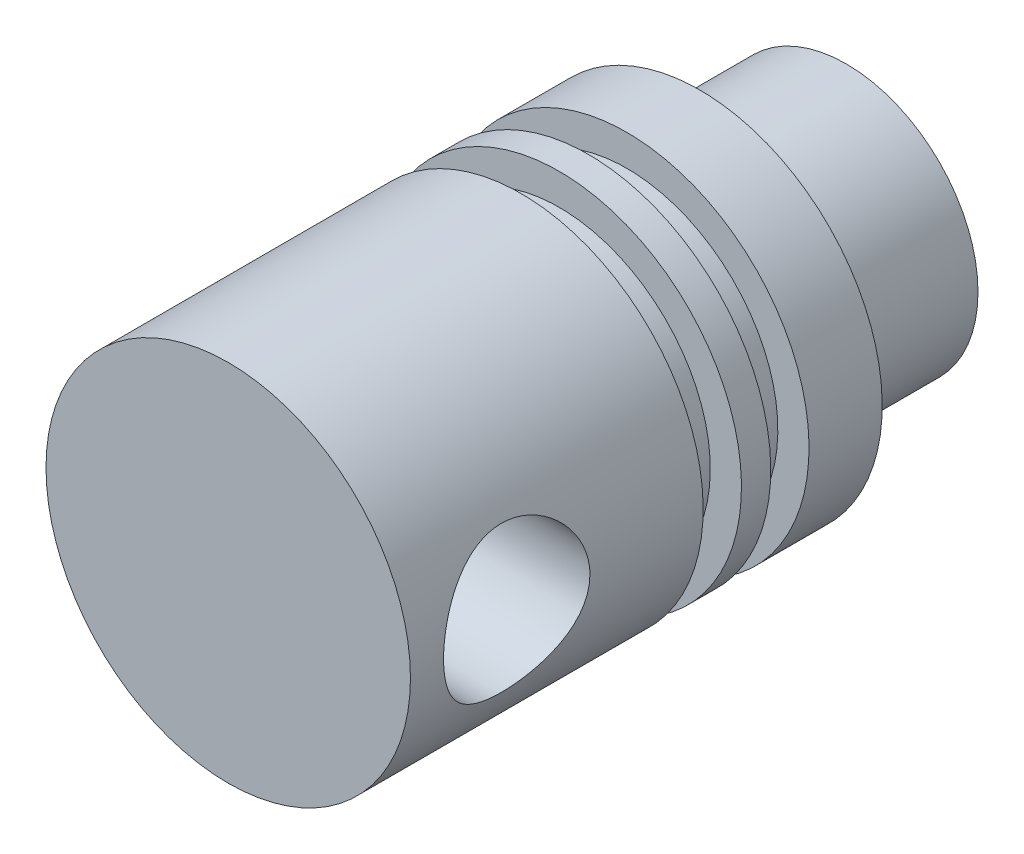
ISO-10303-21;
HEADER;
FILE_DESCRIPTION(('STEP AP214'),'2;1');
FILE_NAME('part.step','',(''),(''),'','','');
FILE_SCHEMA(('AUTOMOTIVE_DESIGN { 1 0 10303 214 1 1 1 1 }'));
ENDSEC;
DATA;
#1=APPLICATION_CONTEXT('core data for automotive mechanical design processes');
#2=APPLICATION_PROTOCOL_DEFINITION('international standard','automotive_design',2000,#1);
#3=PRODUCT_CONTEXT('',#1,'mechanical');
#4=PRODUCT('Part','Part','',(#3));
#5=PRODUCT_RELATED_PRODUCT_CATEGORY('part','',(#4));
#6=PRODUCT_DEFINITION_FORMATION('','',#4);
#7=PRODUCT_DEFINITION_CONTEXT('part definition',#1,'design');
#8=PRODUCT_DEFINITION('design','',#6,#7);
#9=PRODUCT_DEFINITION_SHAPE('','',#8);
#10=(LENGTH_UNIT() NAMED_UNIT(*) SI_UNIT(.MILLI.,.METRE.));
#11=(NAMED_UNIT(*) PLANE_ANGLE_UNIT() SI_UNIT($,.RADIAN.));
#12=(NAMED_UNIT(*) SI_UNIT($,.STERADIAN.) SOLID_ANGLE_UNIT());
#13=UNCERTAINTY_MEASURE_WITH_UNIT(LENGTH_MEASURE(1.E-05),#10,'distance_accuracy_value','');
#14=(GEOMETRIC_REPRESENTATION_CONTEXT(3) GLOBAL_UNCERTAINTY_ASSIGNED_CONTEXT((#13)) GLOBAL_UNIT_ASSIGNED_CONTEXT((#10,
#11,#12)) REPRESENTATION_CONTEXT('',''));
#15=CARTESIAN_POINT('',(0.,0.,0.));
#16=DIRECTION('',(0.,0.,1.));
#17=DIRECTION('',(1.,0.,0.));
#18=AXIS2_PLACEMENT_3D('',#15,#16,#17);
#19=CARTESIAN_POINT('',(0.,0.,0.));
#20=DIRECTION('',(0.,0.,1.));
#21=DIRECTION('',(0.,-1.,0.));
#22=AXIS2_PLACEMENT_3D('',#19,#20,#21);
#23=PLANE('',#22);
#24=CARTESIAN_POINT('',(0.,0.,0.));
#25=DIRECTION('',(0.,0.,1.));
#26=DIRECTION('',(0.,-1.,0.));
#27=AXIS2_PLACEMENT_3D('',#24,#25,#26);
#28=CIRCLE('',#27,8.99487736956568);
#29=CARTESIAN_POINT('',(0.,-8.99487736956568,0.));
#30=VERTEX_POINT('',#29);
#31=EDGE_CURVE('E60',#30,#30,#28,.F.);
#32=ORIENTED_EDGE('',*,*,#31,.F.);
#33=EDGE_LOOP('',(#32));
#34=FACE_BOUND('',#33,.T.);
#35=CARTESIAN_POINT('',(0.,0.,0.));
#36=DIRECTION('',(0.,0.,1.));
#37=DIRECTION('',(0.,-1.,0.));
#38=AXIS2_PLACEMENT_3D('',#35,#36,#37);
#39=CIRCLE('',#38,12.45);
#40=CARTESIAN_POINT('',(0.,-12.45,0.));
#41=VERTEX_POINT('',#40);
#42=EDGE_CURVE('E65',#41,#41,#39,.T.);
#43=ORIENTED_EDGE('',*,*,#42,.F.);
#44=EDGE_LOOP('',(#43));
#45=FACE_BOUND('',#44,.T.);
#46=ADVANCED_FACE('F43',(#34,#45),#23,.F.);
#47=CARTESIAN_POINT('',(0.,0.,17.2324));
#48=DIRECTION('',(0.,0.,1.));
#49=DIRECTION('',(0.,-1.,0.));
#50=AXIS2_PLACEMENT_3D('',#47,#48,#49);
#51=CYLINDRICAL_SURFACE('',#50,12.45);
#52=CARTESIAN_POINT('',(0.,0.,5.));
#53=DIRECTION('',(0.,0.,1.));
#54=DIRECTION('',(0.,-1.,0.));
#55=AXIS2_PLACEMENT_3D('',#52,#53,#54);
#56=CIRCLE('',#55,12.45);
#57=CARTESIAN_POINT('',(0.,-12.45,5.));
#58=VERTEX_POINT('',#57);
#59=EDGE_CURVE('E161',#58,#58,#56,.T.);
#60=ORIENTED_EDGE('',*,*,#59,.F.);
#61=EDGE_LOOP('',(#60));
#62=FACE_BOUND('',#61,.T.);
#63=ORIENTED_EDGE('',*,*,#42,.T.);
#64=EDGE_LOOP('',(#63));
#65=FACE_BOUND('',#64,.T.);
#66=ADVANCED_FACE('F101',(#62,#65),#51,.T.);
#67=CARTESIAN_POINT('',(0.,12.45,5.));
#68=DIRECTION('',(0.,0.,-1.));
#69=DIRECTION('',(0.,1.,0.));
#70=AXIS2_PLACEMENT_3D('',#67,#68,#69);
#71=PLANE('',#70);
#72=CARTESIAN_POINT('',(0.,0.,5.));
#73=DIRECTION('',(0.,0.,1.));
#74=DIRECTION('',(0.,-1.,0.));
#75=AXIS2_PLACEMENT_3D('',#72,#73,#74);
#76=CIRCLE('',#75,10.32);
#77=CARTESIAN_POINT('',(0.,-10.32,5.));
#78=VERTEX_POINT('',#77);
#79=EDGE_CURVE('E157',#78,#78,#76,.T.);
#80=ORIENTED_EDGE('',*,*,#79,.F.);
#81=EDGE_LOOP('',(#80));
#82=FACE_BOUND('',#81,.T.);
#83=ORIENTED_EDGE('',*,*,#59,.T.);
#84=EDGE_LOOP('',(#83));
#85=FACE_BOUND('',#84,.T.);
#86=ADVANCED_FACE('F106',(#82,#85),#71,.F.);
#87=CARTESIAN_POINT('',(0.,0.,17.2324));
#88=DIRECTION('',(0.,0.,1.));
#89=DIRECTION('',(0.,-1.,0.));
#90=AXIS2_PLACEMENT_3D('',#87,#88,#89);
#91=CYLINDRICAL_SURFACE('',#90,10.32);
#92=CARTESIAN_POINT('',(0.,0.,7.6162));
#93=DIRECTION('',(0.,0.,1.));
#94=DIRECTION('',(0.,-1.,0.));
#95=AXIS2_PLACEMENT_3D('',#92,#93,#94);
#96=CIRCLE('',#95,10.32);
#97=CARTESIAN_POINT('',(0.,-10.32,7.6162));
#98=VERTEX_POINT('',#97);
#99=EDGE_CURVE('E153',#98,#98,#96,.T.);
#100=ORIENTED_EDGE('',*,*,#99,.F.);
#101=EDGE_LOOP('',(#100));
#102=FACE_BOUND('',#101,.T.);
#103=ORIENTED_EDGE('',*,*,#79,.T.);
#104=EDGE_LOOP('',(#103));
#105=FACE_BOUND('',#104,.T.);
#106=ADVANCED_FACE('F171',(#102,#105),#91,.T.);
#107=CARTESIAN_POINT('',(0.,10.32,7.6162));
#108=DIRECTION('',(0.,0.,1.));
#109=DIRECTION('',(0.,-1.,0.));
#110=AXIS2_PLACEMENT_3D('',#107,#108,#109);
#111=PLANE('',#110);
#112=CARTESIAN_POINT('',(0.,0.,7.6162));
#113=DIRECTION('',(0.,0.,1.));
#114=DIRECTION('',(0.,-1.,0.));
#115=AXIS2_PLACEMENT_3D('',#112,#113,#114);
#116=CIRCLE('',#115,12.45);
#117=CARTESIAN_POINT('',(0.,-12.45,7.6162));
#118=VERTEX_POINT('',#117);
#119=EDGE_CURVE('E149',#118,#118,#116,.T.);
#120=ORIENTED_EDGE('',*,*,#119,.F.);
#121=EDGE_LOOP('',(#120));
#122=FACE_BOUND('',#121,.T.);
#123=ORIENTED_EDGE('',*,*,#99,.T.);
#124=EDGE_LOOP('',(#123));
#125=FACE_BOUND('',#124,.T.);
#126=ADVANCED_FACE('F177',(#122,#125),#111,.F.);
#127=CARTESIAN_POINT('',(0.,0.,17.2324));
#128=DIRECTION('',(0.,0.,1.));
#129=DIRECTION('',(0.,-1.,0.));
#130=AXIS2_PLACEMENT_3D('',#127,#128,#129);
#131=CYLINDRICAL_SURFACE('',#130,12.45);
#132=CARTESIAN_POINT('',(0.,0.,9.6162));
#133=DIRECTION('',(0.,0.,1.));
#134=DIRECTION('',(0.,-1.,0.));
#135=AXIS2_PLACEMENT_3D('',#132,#133,#134);
#136=CIRCLE('',#135,12.45);
#137=CARTESIAN_POINT('',(0.,-12.45,9.6162));
#138=VERTEX_POINT('',#137);
#139=EDGE_CURVE('E145',#138,#138,#136,.T.);
#140=ORIENTED_EDGE('',*,*,#139,.F.);
#141=EDGE_LOOP('',(#140));
#142=FACE_BOUND('',#141,.T.);
#143=ORIENTED_EDGE('',*,*,#119,.T.);
#144=EDGE_LOOP('',(#143));
#145=FACE_BOUND('',#144,.T.);
#146=ADVANCED_FACE('F184',(#142,#145),#131,.T.);
#147=CARTESIAN_POINT('',(0.,12.45,9.6162));
#148=DIRECTION('',(0.,0.,-1.));
#149=DIRECTION('',(0.,1.,0.));
#150=AXIS2_PLACEMENT_3D('',#147,#148,#149);
#151=PLANE('',#150);
#152=CARTESIAN_POINT('',(0.,0.,9.6162));
#153=DIRECTION('',(0.,0.,1.));
#154=DIRECTION('',(0.,-1.,0.));
#155=AXIS2_PLACEMENT_3D('',#152,#153,#154);
#156=CIRCLE('',#155,10.32);
#157=CARTESIAN_POINT('',(0.,-10.32,9.6162));
#158=VERTEX_POINT('',#157);
#159=EDGE_CURVE('E141',#158,#158,#156,.T.);
#160=ORIENTED_EDGE('',*,*,#159,.F.);
#161=EDGE_LOOP('',(#160));
#162=FACE_BOUND('',#161,.T.);
#163=ORIENTED_EDGE('',*,*,#139,.T.);
#164=EDGE_LOOP('',(#163));
#165=FACE_BOUND('',#164,.T.);
#166=ADVANCED_FACE('F188',(#162,#165),#151,.F.);
#167=CARTESIAN_POINT('',(0.,0.,17.2324));
#168=DIRECTION('',(0.,0.,1.));
#169=DIRECTION('',(0.,-1.,0.));
#170=AXIS2_PLACEMENT_3D('',#167,#168,#169);
#171=CYLINDRICAL_SURFACE('',#170,10.32);
#172=CARTESIAN_POINT('',(0.,0.,12.2324));
#173=DIRECTION('',(0.,0.,1.));
#174=DIRECTION('',(0.,-1.,0.));
#175=AXIS2_PLACEMENT_3D('',#172,#173,#174);
#176=CIRCLE('',#175,10.32);
#177=CARTESIAN_POINT('',(0.,-10.32,12.2324));
#178=VERTEX_POINT('',#177);
#179=EDGE_CURVE('E137',#178,#178,#176,.T.);
#180=ORIENTED_EDGE('',*,*,#179,.F.);
#181=EDGE_LOOP('',(#180));
#182=FACE_BOUND('',#181,.T.);
#183=ORIENTED_EDGE('',*,*,#159,.T.);
#184=EDGE_LOOP('',(#183));
#185=FACE_BOUND('',#184,.T.);
#186=ADVANCED_FACE('F192',(#182,#185),#171,.T.);
#187=CARTESIAN_POINT('',(0.,10.32,12.2324));
#188=DIRECTION('',(0.,0.,1.));
#189=DIRECTION('',(0.,-1.,0.));
#190=AXIS2_PLACEMENT_3D('',#187,#188,#189);
#191=PLANE('',#190);
#192=CARTESIAN_POINT('',(0.,0.,12.2324));
#193=DIRECTION('',(0.,0.,1.));
#194=DIRECTION('',(0.,-1.,0.));
#195=AXIS2_PLACEMENT_3D('',#192,#193,#194);
#196=CIRCLE('',#195,12.45);
#197=CARTESIAN_POINT('',(0.,-12.45,12.2324));
#198=VERTEX_POINT('',#197);
#199=EDGE_CURVE('E133',#198,#198,#196,.T.);
#200=ORIENTED_EDGE('',*,*,#199,.F.);
#201=EDGE_LOOP('',(#200));
#202=FACE_BOUND('',#201,.T.);
#203=ORIENTED_EDGE('',*,*,#179,.T.);
#204=EDGE_LOOP('',(#203));
#205=FACE_BOUND('',#204,.T.);
#206=ADVANCED_FACE('F195',(#202,#205),#191,.F.);
#207=CARTESIAN_POINT('',(0.,0.,17.2324));
#208=DIRECTION('',(0.,0.,1.));
#209=DIRECTION('',(0.,-1.,0.));
#210=AXIS2_PLACEMENT_3D('',#207,#208,#209);
#211=CYLINDRICAL_SURFACE('',#210,12.45);
#212=CARTESIAN_POINT('',(-12.45,0.,19.9689142183144));
#213=CARTESIAN_POINT('',(-12.4499993849845,0.134384622582183,19.9689150063196));
#214=CARTESIAN_POINT('',(-12.4478181298827,0.268820501387581,19.9743394732029));
#215=CARTESIAN_POINT('',(-12.4391477656539,0.53674050661934,19.9959881993196));
#216=CARTESIAN_POINT('',(-12.4326557936837,0.670223940919772,20.0122196357219));
#217=CARTESIAN_POINT('',(-12.4155173549331,0.935481908093614,20.0553651973054));
#218=CARTESIAN_POINT('',(-12.404862019029,1.06725216806623,20.0823021302872));
#219=CARTESIAN_POINT('',(-12.3796748883017,1.32789507112944,20.1465989861043));
#220=CARTESIAN_POINT('',(-12.3651415094737,1.45676650680702,20.1839631682846));
#221=CARTESIAN_POINT('',(-12.3326347332882,1.71022716945198,20.2686055800576));
#222=CARTESIAN_POINT('',(-12.3146743394657,1.83483054805701,20.3158463963984));
#223=CARTESIAN_POINT('',(-12.2757314539914,2.07949480109251,20.4199139530809));
#224=CARTESIAN_POINT('',(-12.2547478338538,2.19955395806724,20.4767442742787));
#225=CARTESIAN_POINT('',(-12.1880451678497,2.55164725584186,20.6608877588121));
#226=CARTESIAN_POINT('',(-12.1385271909343,2.77594794000054,20.8019714934519));
#227=CARTESIAN_POINT('',(-12.0318158734724,3.2077481171529,21.123646006736));
#228=CARTESIAN_POINT('',(-11.9743833081886,3.41410254495996,21.3056806878763));
#229=CARTESIAN_POINT('',(-11.8593551712139,3.79442782562792,21.7012683103889));
#230=CARTESIAN_POINT('',(-11.801759533316,3.96838272330143,21.9148366882506));
#231=CARTESIAN_POINT('',(-11.7186534623867,4.20512927538371,22.2601114147153));
#232=CARTESIAN_POINT('',(-11.6909414112491,4.28136997505087,22.3822817666794));
#233=CARTESIAN_POINT('',(-11.6380124714055,4.42322138523912,22.6331398120773));
#234=CARTESIAN_POINT('',(-11.6127945576206,4.48883646996519,22.7618247948746));
#235=CARTESIAN_POINT('',(-11.5656786884078,4.60887632121988,23.0249047545544));
#236=CARTESIAN_POINT('',(-11.543780949972,4.66330035643351,23.159300103907));
#237=CARTESIAN_POINT('',(-11.5040809871808,4.76039637729998,23.4327937523474));
#238=CARTESIAN_POINT('',(-11.4862767069677,4.8030742643533,23.5718896502394));
#239=CARTESIAN_POINT('',(-11.456107860263,4.87458007306466,23.8473976073207));
#240=CARTESIAN_POINT('',(-11.4435338473542,4.90394668021587,23.9836469363878));
#241=CARTESIAN_POINT('',(-11.4231586579899,4.95122322552998,24.2584143772456));
#242=CARTESIAN_POINT('',(-11.4153553214452,4.96913834891702,24.3969314330293));
#243=CARTESIAN_POINT('',(-11.4048009537497,4.99331454057145,24.6751415961694));
#244=CARTESIAN_POINT('',(-11.402048833698,4.99957812058963,24.8148344435335));
#245=CARTESIAN_POINT('',(-11.4016970390184,5.00038058819365,25.094256859812));
#246=CARTESIAN_POINT('',(-11.4040971212448,4.99492002907218,25.2339864266824));
#247=CARTESIAN_POINT('',(-11.4136096945926,4.97314182883112,25.5024904221433));
#248=CARTESIAN_POINT('',(-11.420377822922,4.95761723335474,25.6313423350121));
#249=CARTESIAN_POINT('',(-11.4380712784649,4.91665766069806,25.8872123016819));
#250=CARTESIAN_POINT('',(-11.4489979730345,4.8912194237995,26.0142297380252));
#251=CARTESIAN_POINT('',(-11.4746706367924,4.83068458042345,26.2655172574509));
#252=CARTESIAN_POINT('',(-11.4894156908646,4.79559028801065,26.3897879910791));
#253=CARTESIAN_POINT('',(-11.5222870280292,4.71606245867663,26.6348611474171));
#254=CARTESIAN_POINT('',(-11.5404146106774,4.67162533143606,26.7556622164408));
#255=CARTESIAN_POINT('',(-11.5999129023979,4.52284587433726,27.116553229877));
#256=CARTESIAN_POINT('',(-11.6458651594676,4.40423049967629,27.3501865752089));
#257=CARTESIAN_POINT('',(-11.7448659587822,4.13296445503128,27.7949734630817));
#258=CARTESIAN_POINT('',(-11.7979171765917,3.98030093792945,28.006118475726));
#259=CARTESIAN_POINT('',(-11.910184151056,3.63127698252056,28.4174087278636));
#260=CARTESIAN_POINT('',(-11.9695580193678,3.43243737772658,28.6154122372431));
#261=CARTESIAN_POINT('',(-12.0842870988381,3.0035967239359,28.9760078400866));
#262=CARTESIAN_POINT('',(-12.139641495262,2.77358938426483,29.1385927675965));
#263=CARTESIAN_POINT('',(-12.2157426263525,2.40712243191311,29.3537119961635));
#264=CARTESIAN_POINT('',(-12.2401689218434,2.27996590490427,29.4211655623006));
#265=CARTESIAN_POINT('',(-12.285768584927,2.01984681753404,29.5450409444496));
#266=CARTESIAN_POINT('',(-12.3069432826621,1.88688666002319,29.6014672740007));
#267=CARTESIAN_POINT('',(-12.3454189557428,1.6161172075677,29.7027352692787));
#268=CARTESIAN_POINT('',(-12.3627206981462,1.47830887909492,29.7475792292224));
#269=CARTESIAN_POINT('',(-12.3929396030893,1.19886930908799,29.8252228425391));
#270=CARTESIAN_POINT('',(-12.4058570719687,1.05723833539811,29.8580233374311));
#271=CARTESIAN_POINT('',(-12.4262816586186,0.779867775157141,29.9096126414529));
#272=CARTESIAN_POINT('',(-12.4340660736735,0.644282223588987,29.9291219273773));
#273=CARTESIAN_POINT('',(-12.4451965388251,0.371735422932765,29.9569580210771));
#274=CARTESIAN_POINT('',(-12.4485410736696,0.234773720248202,29.9652810111807));
#275=CARTESIAN_POINT('',(-12.4506918137549,-0.0393213637567913,29.9706371621097));
#276=CARTESIAN_POINT('',(-12.4495007904197,-0.176454589069339,29.9676772173002));
#277=CARTESIAN_POINT('',(-12.4426187201231,-0.449952846044281,29.9505126219676));
#278=CARTESIAN_POINT('',(-12.4369260232206,-0.586317577580991,29.9363038485524));
#279=CARTESIAN_POINT('',(-12.4215588182023,-0.850960969736017,29.8976990773306));
#280=CARTESIAN_POINT('',(-12.4120787351446,-0.979323813874796,29.8737997574667));
#281=CARTESIAN_POINT('',(-12.3893995846024,-1.23351896394575,29.8161221387384));
#282=CARTESIAN_POINT('',(-12.3761992152255,-1.35935036747038,29.7823403814152));
#283=CARTESIAN_POINT('',(-12.3464062672317,-1.60759725109776,29.7052117074863));
#284=CARTESIAN_POINT('',(-12.3298146708062,-1.73001370862083,29.6618675601203));
#285=CARTESIAN_POINT('',(-12.2936370402513,-1.97074646467547,29.5659756320918));
#286=CARTESIAN_POINT('',(-12.2740498672699,-2.08906118274255,29.5134243499694));
#287=CARTESIAN_POINT('',(-12.2101962157351,-2.4438268188019,29.3390855391187));
#288=CARTESIAN_POINT('',(-12.1617649171829,-2.6726653539492,29.2029219075331));
#289=CARTESIAN_POINT('',(-12.0586680219573,-3.10493175895916,28.8969756119655));
#290=CARTESIAN_POINT('',(-12.0039999195814,-3.30834934642405,28.7271794154296));
#291=CARTESIAN_POINT('',(-11.8898562912962,-3.69834769837537,28.3455284086104));
#292=CARTESIAN_POINT('',(-11.8303029334433,-3.88290736875006,28.1316267471484));
#293=CARTESIAN_POINT('',(-11.7164396126084,-4.21406215884975,27.674683983216));
#294=CARTESIAN_POINT('',(-11.6621305438196,-4.36065081135757,27.4316379271766));
#295=CARTESIAN_POINT('',(-11.5892886325268,-4.54922845062515,27.0486108763136));
#296=CARTESIAN_POINT('',(-11.5663417522621,-4.60710314920819,26.9170740847824));
#297=CARTESIAN_POINT('',(-11.5242220474161,-4.71147310534209,26.6489958840632));
#298=CARTESIAN_POINT('',(-11.5050475821525,-4.75797331198803,26.5124566812877));
#299=CARTESIAN_POINT('',(-11.4711650372952,-4.83909153430274,26.2354155865059));
#300=CARTESIAN_POINT('',(-11.4564551741404,-4.87371429560661,26.0949153014898));
#301=CARTESIAN_POINT('',(-11.4320452478042,-4.93070044664169,25.8110217610373));
#302=CARTESIAN_POINT('',(-11.4223447604131,-4.95306487445713,25.6676287516347));
#303=CARTESIAN_POINT('',(-11.4088424654101,-4.98408220004558,25.3896721490039));
#304=CARTESIAN_POINT('',(-11.4046632120159,-4.9936134477567,25.2552242140268));
#305=CARTESIAN_POINT('',(-11.4010812226137,-5.0017865337278,24.9858849683363));
#306=CARTESIAN_POINT('',(-11.4016800896607,-5.00042471737443,24.8509935239991));
#307=CARTESIAN_POINT('',(-11.4076364814252,-4.98682102712713,24.5819364645749));
#308=CARTESIAN_POINT('',(-11.4129916115953,-4.97458462805515,24.4477705184264));
#309=CARTESIAN_POINT('',(-11.4282746738088,-4.9393729311559,24.1810714711926));
#310=CARTESIAN_POINT('',(-11.4382043292304,-4.91639358604962,24.048539004832));
#311=CARTESIAN_POINT('',(-11.461814463176,-4.86108773814031,23.7914598175857));
#312=CARTESIAN_POINT('',(-11.4753260271653,-4.82917925645392,23.6668074975611));
#313=CARTESIAN_POINT('',(-11.5058466193423,-4.75600221228715,23.4207058288695));
#314=CARTESIAN_POINT('',(-11.5228568613287,-4.71473040086734,23.2992576083455));
#315=CARTESIAN_POINT('',(-11.5784286610027,-4.5773683941021,22.9408504127528));
#316=CARTESIAN_POINT('',(-11.6215492248579,-4.46769176054197,22.7096455961119));
#317=CARTESIAN_POINT('',(-11.7181272386408,-4.20811114698248,22.2551883751802));
#318=CARTESIAN_POINT('',(-11.7720367417964,-4.05625543084916,22.0331592599819));
#319=CARTESIAN_POINT('',(-11.8827909838018,-3.71929118709976,21.6165156530928));
#320=CARTESIAN_POINT('',(-11.9396366165239,-3.53417248990935,21.4219095780734));
#321=CARTESIAN_POINT('',(-12.0246941613557,-3.22823137846655,21.1480545433008));
#322=CARTESIAN_POINT('',(-12.0538895735311,-3.11771516073413,21.0573509362912));
#323=CARTESIAN_POINT('',(-12.110722034434,-2.88907648316434,20.8855757394978));
#324=CARTESIAN_POINT('',(-12.1383596420816,-2.77095678436197,20.8045006834067));
#325=CARTESIAN_POINT('',(-12.1913377382985,-2.52770582240961,20.6525156098905));
#326=CARTESIAN_POINT('',(-12.2166760522194,-2.40256809896038,20.5816151794285));
#327=CARTESIAN_POINT('',(-12.2643038542011,-2.14623645069108,20.4506881644307));
#328=CARTESIAN_POINT('',(-12.2865947387134,-2.01504533688319,20.3906565952396));
#329=CARTESIAN_POINT('',(-12.3271295270132,-1.74986949412123,20.2829706880062));
#330=CARTESIAN_POINT('',(-12.3454389172209,-1.61597723913272,20.2351134413468));
#331=CARTESIAN_POINT('',(-12.377977738345,-1.34420331029648,20.1508915503491));
#332=CARTESIAN_POINT('',(-12.3922090873928,-1.20632354570711,20.1145215021116));
#333=CARTESIAN_POINT('',(-12.4161544453934,-0.927944247853957,20.0537163033647));
#334=CARTESIAN_POINT('',(-12.4258797776105,-0.787452214330561,20.0292512287285));
#335=CARTESIAN_POINT('',(-12.4405695020006,-0.504716605594005,19.9924136467981));
#336=CARTESIAN_POINT('',(-12.4455374882191,-0.362474434980535,19.980032010659));
#337=CARTESIAN_POINT('',(-12.4487040653901,-0.183343564899273,19.972141989146));
#338=CARTESIAN_POINT('',(-12.4491898250255,-0.146688067365461,19.9709318496174));
#339=CARTESIAN_POINT('',(-12.4498378762291,-0.07335631942856,19.9693178567467));
#340=CARTESIAN_POINT('',(-12.4500001678675,-0.0366800690299786,19.9689140032296));
#341=CARTESIAN_POINT('',(-12.45,0.,19.9689142183144));
#342=B_SPLINE_CURVE_WITH_KNOTS('',3,(#212,#213,#214,#215,#216,#217,#218,#219,#220,#221,#222,
#223,#224,#225,#226,#227,#228,#229,#230,#231,#232,#233,#234,#235,#236,#237,#238,#239,#240,#241,
#242,#243,#244,#245,#246,#247,#248,#249,#250,#251,#252,#253,#254,#255,#256,#257,#258,#259,#260,
#261,#262,#263,#264,#265,#266,#267,#268,#269,#270,#271,#272,#273,#274,#275,#276,#277,#278,#279,
#280,#281,#282,#283,#284,#285,#286,#287,#288,#289,#290,#291,#292,#293,#294,#295,#296,#297,#298,
#299,#300,#301,#302,#303,#304,#305,#306,#307,#308,#309,#310,#311,#312,#313,#314,#315,#316,#317,
#318,#319,#320,#321,#322,#323,#324,#325,#326,#327,#328,#329,#330,#331,#332,#333,#334,#335,#336,
#337,#338,#339,#340,#341),.UNSPECIFIED.,.T.,.F.,(4,2,2,2,2,2,2,2,2,2,2,2,2,2,2,2,2,2,2,2,2,2,2,
2,2,2,2,2,2,2,2,2,2,2,2,2,2,2,2,2,2,2,2,2,2,2,2,2,2,2,2,2,2,2,2,2,2,2,2,2,2,2,2,2,4),(0.,
0.403116193073395,0.806500372727143,1.21074859953475,1.61516219682897,2.01807074325361,
2.4211300757008,3.22614276096203,4.06594656215481,4.90616283855175,5.34565672552811,
5.78496922531468,6.2243104242674,6.66343048851663,7.08270849189212,7.50179651173419,
7.92079417730584,8.33977206971977,8.72919468763249,9.11874546032159,9.508202958721,
9.89781039457966,10.6921917097058,11.4868732711184,12.3435244667253,13.2003488209745,
13.6378710610141,14.075213842772,14.5124699298343,14.9496954584644,15.3607803665726,
15.7720055346168,16.1829794664549,16.5941040971922,16.9863885500248,17.3788104513274,
17.7711188572448,18.1635767826049,18.9717392178361,19.7802274920108,20.6425148955917,
21.5049490673894,21.9410492514623,22.3769593474166,22.8126950720183,23.2483938910895,
23.6524288941563,24.056599456293,24.4605666534653,24.8646861633381,25.2523750598307,
25.6401986850452,26.4152870909052,27.234979072428,28.0549220881604,28.4922523167813,
28.9294246248641,29.3670061879822,29.8043865571481,30.2339125409359,30.663236161701,
31.0914749953138,31.5193900502956,31.6294199980279,31.7394499218757),.UNSPECIFIED.);
#343=CARTESIAN_POINT('',(-12.45,0.,19.9689142183144));
#344=VERTEX_POINT('',#343);
#345=EDGE_CURVE('E11',#344,#344,#342,.T.);
#346=ORIENTED_EDGE('',*,*,#345,.T.);
#347=EDGE_LOOP('',(#346));
#348=FACE_BOUND('',#347,.T.);
#349=CARTESIAN_POINT('',(12.45,0.,19.9689142183144));
#350=CARTESIAN_POINT('',(12.4499993849845,-0.134384622582183,19.9689150063196));
#351=CARTESIAN_POINT('',(12.4478181298827,-0.268820501387581,19.9743394732029));
#352=CARTESIAN_POINT('',(12.4391477656539,-0.53674050661934,19.9959881993196));
#353=CARTESIAN_POINT('',(12.4326557936837,-0.670223940919772,20.0122196357219));
#354=CARTESIAN_POINT('',(12.4155173549331,-0.935481908093614,20.0553651973054));
#355=CARTESIAN_POINT('',(12.404862019029,-1.06725216806623,20.0823021302872));
#356=CARTESIAN_POINT('',(12.3796748883017,-1.32789507112944,20.1465989861043));
#357=CARTESIAN_POINT('',(12.3651415094737,-1.45676650680702,20.1839631682846));
#358=CARTESIAN_POINT('',(12.3326347332882,-1.71022716945198,20.2686055800576));
#359=CARTESIAN_POINT('',(12.3146743394657,-1.83483054805701,20.3158463963984));
#360=CARTESIAN_POINT('',(12.2757314539914,-2.07949480109251,20.4199139530809));
#361=CARTESIAN_POINT('',(12.2547478338538,-2.19955395806724,20.4767442742787));
#362=CARTESIAN_POINT('',(12.1880451678497,-2.55164725584186,20.6608877588121));
#363=CARTESIAN_POINT('',(12.1385271909343,-2.77594794000054,20.8019714934519));
#364=CARTESIAN_POINT('',(12.0318158734724,-3.2077481171529,21.123646006736));
#365=CARTESIAN_POINT('',(11.9743833081886,-3.41410254495996,21.3056806878763));
#366=CARTESIAN_POINT('',(11.8593551712139,-3.79442782562792,21.7012683103889));
#367=CARTESIAN_POINT('',(11.801759533316,-3.96838272330143,21.9148366882506));
#368=CARTESIAN_POINT('',(11.7186534623867,-4.20512927538371,22.2601114147153));
#369=CARTESIAN_POINT('',(11.6909414112491,-4.28136997505087,22.3822817666794));
#370=CARTESIAN_POINT('',(11.6380124714055,-4.42322138523912,22.6331398120773));
#371=CARTESIAN_POINT('',(11.6127945576206,-4.48883646996519,22.7618247948746));
#372=CARTESIAN_POINT('',(11.5656786884078,-4.60887632121988,23.0249047545544));
#373=CARTESIAN_POINT('',(11.543780949972,-4.66330035643351,23.159300103907));
#374=CARTESIAN_POINT('',(11.5040809871808,-4.76039637729998,23.4327937523474));
#375=CARTESIAN_POINT('',(11.4862767069677,-4.8030742643533,23.5718896502394));
#376=CARTESIAN_POINT('',(11.456107860263,-4.87458007306466,23.8473976073207));
#377=CARTESIAN_POINT('',(11.4435338473542,-4.90394668021587,23.9836469363878));
#378=CARTESIAN_POINT('',(11.4231586579899,-4.95122322552998,24.2584143772456));
#379=CARTESIAN_POINT('',(11.4153553214452,-4.96913834891702,24.3969314330293));
#380=CARTESIAN_POINT('',(11.4048009537497,-4.99331454057145,24.6751415961694));
#381=CARTESIAN_POINT('',(11.402048833698,-4.99957812058963,24.8148344435335));
#382=CARTESIAN_POINT('',(11.4016970390184,-5.00038058819365,25.094256859812));
#383=CARTESIAN_POINT('',(11.4040971212448,-4.99492002907218,25.2339864266824));
#384=CARTESIAN_POINT('',(11.4136096945926,-4.97314182883112,25.5024904221433));
#385=CARTESIAN_POINT('',(11.420377822922,-4.95761723335474,25.6313423350121));
#386=CARTESIAN_POINT('',(11.4380712784649,-4.91665766069806,25.8872123016819));
#387=CARTESIAN_POINT('',(11.4489979730345,-4.8912194237995,26.0142297380252));
#388=CARTESIAN_POINT('',(11.4746706367924,-4.83068458042345,26.2655172574509));
#389=CARTESIAN_POINT('',(11.4894156908646,-4.79559028801065,26.3897879910791));
#390=CARTESIAN_POINT('',(11.5222870280292,-4.71606245867663,26.6348611474171));
#391=CARTESIAN_POINT('',(11.5404146106774,-4.67162533143606,26.7556622164408));
#392=CARTESIAN_POINT('',(11.5999129023979,-4.52284587433726,27.116553229877));
#393=CARTESIAN_POINT('',(11.6458651594676,-4.40423049967629,27.3501865752089));
#394=CARTESIAN_POINT('',(11.7448659587822,-4.13296445503128,27.7949734630817));
#395=CARTESIAN_POINT('',(11.7979171765917,-3.98030093792945,28.006118475726));
#396=CARTESIAN_POINT('',(11.910184151056,-3.63127698252056,28.4174087278636));
#397=CARTESIAN_POINT('',(11.9695580193678,-3.43243737772658,28.6154122372431));
#398=CARTESIAN_POINT('',(12.0842870988381,-3.0035967239359,28.9760078400866));
#399=CARTESIAN_POINT('',(12.139641495262,-2.77358938426483,29.1385927675965));
#400=CARTESIAN_POINT('',(12.2157426263525,-2.40712243191311,29.3537119961635));
#401=CARTESIAN_POINT('',(12.2401689218434,-2.27996590490427,29.4211655623006));
#402=CARTESIAN_POINT('',(12.285768584927,-2.01984681753404,29.5450409444496));
#403=CARTESIAN_POINT('',(12.3069432826621,-1.88688666002319,29.6014672740007));
#404=CARTESIAN_POINT('',(12.3454189557428,-1.6161172075677,29.7027352692787));
#405=CARTESIAN_POINT('',(12.3627206981462,-1.47830887909492,29.7475792292224));
#406=CARTESIAN_POINT('',(12.3929396030893,-1.19886930908799,29.8252228425391));
#407=CARTESIAN_POINT('',(12.4058570719687,-1.05723833539811,29.8580233374311));
#408=CARTESIAN_POINT('',(12.4262816586186,-0.779867775157141,29.9096126414529));
#409=CARTESIAN_POINT('',(12.4340660736735,-0.644282223588987,29.9291219273773));
#410=CARTESIAN_POINT('',(12.4451965388251,-0.371735422932765,29.9569580210771));
#411=CARTESIAN_POINT('',(12.4485410736696,-0.234773720248202,29.9652810111807));
#412=CARTESIAN_POINT('',(12.4506918137549,0.0393213637567913,29.9706371621097));
#413=CARTESIAN_POINT('',(12.4495007904197,0.176454589069339,29.9676772173002));
#414=CARTESIAN_POINT('',(12.4426187201231,0.449952846044281,29.9505126219676));
#415=CARTESIAN_POINT('',(12.4369260232206,0.586317577580991,29.9363038485524));
#416=CARTESIAN_POINT('',(12.4215588182023,0.850960969736017,29.8976990773306));
#417=CARTESIAN_POINT('',(12.4120787351446,0.979323813874796,29.8737997574667));
#418=CARTESIAN_POINT('',(12.3893995846024,1.23351896394575,29.8161221387384));
#419=CARTESIAN_POINT('',(12.3761992152255,1.35935036747038,29.7823403814152));
#420=CARTESIAN_POINT('',(12.3464062672317,1.60759725109776,29.7052117074863));
#421=CARTESIAN_POINT('',(12.3298146708062,1.73001370862083,29.6618675601203));
#422=CARTESIAN_POINT('',(12.2936370402513,1.97074646467547,29.5659756320918));
#423=CARTESIAN_POINT('',(12.2740498672699,2.08906118274255,29.5134243499694));
#424=CARTESIAN_POINT('',(12.2101962157351,2.4438268188019,29.3390855391187));
#425=CARTESIAN_POINT('',(12.1617649171829,2.6726653539492,29.2029219075331));
#426=CARTESIAN_POINT('',(12.0586680219573,3.10493175895916,28.8969756119655));
#427=CARTESIAN_POINT('',(12.0039999195814,3.30834934642405,28.7271794154296));
#428=CARTESIAN_POINT('',(11.8898562912962,3.69834769837537,28.3455284086104));
#429=CARTESIAN_POINT('',(11.8303029334433,3.88290736875006,28.1316267471484));
#430=CARTESIAN_POINT('',(11.7164396126084,4.21406215884975,27.674683983216));
#431=CARTESIAN_POINT('',(11.6621305438196,4.36065081135757,27.4316379271766));
#432=CARTESIAN_POINT('',(11.5892886325268,4.54922845062515,27.0486108763136));
#433=CARTESIAN_POINT('',(11.5663417522621,4.60710314920819,26.9170740847824));
#434=CARTESIAN_POINT('',(11.5242220474161,4.71147310534209,26.6489958840632));
#435=CARTESIAN_POINT('',(11.5050475821525,4.75797331198803,26.5124566812877));
#436=CARTESIAN_POINT('',(11.4711650372952,4.83909153430274,26.2354155865059));
#437=CARTESIAN_POINT('',(11.4564551741404,4.87371429560661,26.0949153014898));
#438=CARTESIAN_POINT('',(11.4320452478042,4.93070044664169,25.8110217610373));
#439=CARTESIAN_POINT('',(11.4223447604131,4.95306487445713,25.6676287516347));
#440=CARTESIAN_POINT('',(11.4088424654101,4.98408220004558,25.3896721490039));
#441=CARTESIAN_POINT('',(11.4046632120159,4.9936134477567,25.2552242140268));
#442=CARTESIAN_POINT('',(11.4010812226137,5.0017865337278,24.9858849683363));
#443=CARTESIAN_POINT('',(11.4016800896607,5.00042471737443,24.8509935239991));
#444=CARTESIAN_POINT('',(11.4076364814252,4.98682102712713,24.5819364645749));
#445=CARTESIAN_POINT('',(11.4129916115953,4.97458462805515,24.4477705184264));
#446=CARTESIAN_POINT('',(11.4282746738088,4.9393729311559,24.1810714711926));
#447=CARTESIAN_POINT('',(11.4382043292304,4.91639358604962,24.048539004832));
#448=CARTESIAN_POINT('',(11.461814463176,4.86108773814031,23.7914598175857));
#449=CARTESIAN_POINT('',(11.4753260271653,4.82917925645392,23.6668074975611));
#450=CARTESIAN_POINT('',(11.5058466193423,4.75600221228715,23.4207058288695));
#451=CARTESIAN_POINT('',(11.5228568613287,4.71473040086734,23.2992576083455));
#452=CARTESIAN_POINT('',(11.5784286610027,4.5773683941021,22.9408504127528));
#453=CARTESIAN_POINT('',(11.6215492248579,4.46769176054197,22.7096455961119));
#454=CARTESIAN_POINT('',(11.7181272386408,4.20811114698248,22.2551883751802));
#455=CARTESIAN_POINT('',(11.7720367417964,4.05625543084916,22.0331592599819));
#456=CARTESIAN_POINT('',(11.8827909838018,3.71929118709976,21.6165156530928));
#457=CARTESIAN_POINT('',(11.9396366165239,3.53417248990935,21.4219095780734));
#458=CARTESIAN_POINT('',(12.0246941613557,3.22823137846655,21.1480545433008));
#459=CARTESIAN_POINT('',(12.0538895735311,3.11771516073413,21.0573509362912));
#460=CARTESIAN_POINT('',(12.110722034434,2.88907648316434,20.8855757394978));
#461=CARTESIAN_POINT('',(12.1383596420816,2.77095678436197,20.8045006834067));
#462=CARTESIAN_POINT('',(12.1913377382985,2.52770582240961,20.6525156098905));
#463=CARTESIAN_POINT('',(12.2166760522194,2.40256809896038,20.5816151794285));
#464=CARTESIAN_POINT('',(12.2643038542011,2.14623645069108,20.4506881644307));
#465=CARTESIAN_POINT('',(12.2865947387134,2.01504533688319,20.3906565952396));
#466=CARTESIAN_POINT('',(12.3271295270132,1.74986949412123,20.2829706880062));
#467=CARTESIAN_POINT('',(12.3454389172209,1.61597723913272,20.2351134413468));
#468=CARTESIAN_POINT('',(12.377977738345,1.34420331029648,20.1508915503491));
#469=CARTESIAN_POINT('',(12.3922090873928,1.20632354570711,20.1145215021116));
#470=CARTESIAN_POINT('',(12.4161544453934,0.927944247853957,20.0537163033647));
#471=CARTESIAN_POINT('',(12.4258797776105,0.787452214330561,20.0292512287285));
#472=CARTESIAN_POINT('',(12.4405695020006,0.504716605594005,19.9924136467981));
#473=CARTESIAN_POINT('',(12.4455374882191,0.362474434980535,19.980032010659));
#474=CARTESIAN_POINT('',(12.4487040653901,0.183343564899273,19.972141989146));
#475=CARTESIAN_POINT('',(12.4491898250255,0.146688067365461,19.9709318496174));
#476=CARTESIAN_POINT('',(12.4498378762291,0.07335631942856,19.9693178567467));
#477=CARTESIAN_POINT('',(12.4500001678675,0.0366800690299786,19.9689140032296));
#478=CARTESIAN_POINT('',(12.45,0.,19.9689142183144));
#479=B_SPLINE_CURVE_WITH_KNOTS('',3,(#349,#350,#351,#352,#353,#354,#355,#356,#357,#358,#359,
#360,#361,#362,#363,#364,#365,#366,#367,#368,#369,#370,#371,#372,#373,#374,#375,#376,#377,#378,
#379,#380,#381,#382,#383,#384,#385,#386,#387,#388,#389,#390,#391,#392,#393,#394,#395,#396,#397,
#398,#399,#400,#401,#402,#403,#404,#405,#406,#407,#408,#409,#410,#411,#412,#413,#414,#415,#416,
#417,#418,#419,#420,#421,#422,#423,#424,#425,#426,#427,#428,#429,#430,#431,#432,#433,#434,#435,
#436,#437,#438,#439,#440,#441,#442,#443,#444,#445,#446,#447,#448,#449,#450,#451,#452,#453,#454,
#455,#456,#457,#458,#459,#460,#461,#462,#463,#464,#465,#466,#467,#468,#469,#470,#471,#472,#473,
#474,#475,#476,#477,#478),.UNSPECIFIED.,.T.,.F.,(4,2,2,2,2,2,2,2,2,2,2,2,2,2,2,2,2,2,2,2,2,2,2,
2,2,2,2,2,2,2,2,2,2,2,2,2,2,2,2,2,2,2,2,2,2,2,2,2,2,2,2,2,2,2,2,2,2,2,2,2,2,2,2,2,4),(0.,
0.403116193073395,0.806500372727143,1.21074859953475,1.61516219682897,2.01807074325361,
2.4211300757008,3.22614276096203,4.06594656215481,4.90616283855175,5.34565672552811,
5.78496922531468,6.2243104242674,6.66343048851663,7.08270849189212,7.50179651173419,
7.92079417730584,8.33977206971977,8.72919468763249,9.11874546032159,9.508202958721,
9.89781039457966,10.6921917097058,11.4868732711184,12.3435244667253,13.2003488209745,
13.6378710610141,14.075213842772,14.5124699298343,14.9496954584644,15.3607803665726,
15.7720055346168,16.1829794664549,16.5941040971922,16.9863885500248,17.3788104513274,
17.7711188572448,18.1635767826049,18.9717392178361,19.7802274920108,20.6425148955917,
21.5049490673894,21.9410492514623,22.3769593474166,22.8126950720183,23.2483938910895,
23.6524288941563,24.056599456293,24.4605666534653,24.8646861633381,25.2523750598307,
25.6401986850452,26.4152870909052,27.234979072428,28.0549220881604,28.4922523167813,
28.9294246248641,29.3670061879822,29.8043865571481,30.2339125409359,30.663236161701,
31.0914749953138,31.5193900502956,31.6294199980279,31.7394499218757),.UNSPECIFIED.);
#480=CARTESIAN_POINT('',(12.45,0.,19.9689142183144));
#481=VERTEX_POINT('',#480);
#482=EDGE_CURVE('E55',#481,#481,#479,.T.);
#483=ORIENTED_EDGE('',*,*,#482,.T.);
#484=EDGE_LOOP('',(#483));
#485=FACE_BOUND('',#484,.T.);
#486=ORIENTED_EDGE('',*,*,#199,.T.);
#487=EDGE_LOOP('',(#486));
#488=FACE_BOUND('',#487,.T.);
#489=CARTESIAN_POINT('',(0.,0.,32.2324));
#490=DIRECTION('',(0.,0.,1.));
#491=DIRECTION('',(1.,0.,0.));
#492=AXIS2_PLACEMENT_3D('',#489,#490,#491);
#493=CIRCLE('',#492,12.45);
#494=CARTESIAN_POINT('',(12.45,0.,32.2324));
#495=VERTEX_POINT('',#494);
#496=EDGE_CURVE('E120',#495,#495,#493,.T.);
#497=ORIENTED_EDGE('',*,*,#496,.F.);
#498=EDGE_LOOP('',(#497));
#499=FACE_BOUND('',#498,.T.);
#500=ADVANCED_FACE('F71',(#348,#485,#488,#499),#211,.T.);
#501=CARTESIAN_POINT('',(0.,0.,-10.));
#502=DIRECTION('',(0.,0.,-1.));
#503=DIRECTION('',(0.,1.,0.));
#504=AXIS2_PLACEMENT_3D('',#501,#502,#503);
#505=PLANE('',#504);
#506=CARTESIAN_POINT('',(0.,0.,-10.));
#507=DIRECTION('',(0.,0.,-1.));
#508=DIRECTION('',(0.,1.,0.));
#509=AXIS2_PLACEMENT_3D('',#506,#507,#508);
#510=CIRCLE('',#509,8.99487736956568);
#511=CARTESIAN_POINT('',(0.,8.99487736956568,-10.));
#512=VERTEX_POINT('',#511);
#513=EDGE_CURVE('E125',#512,#512,#510,.T.);
#514=ORIENTED_EDGE('',*,*,#513,.T.);
#515=EDGE_LOOP('',(#514));
#516=FACE_BOUND('',#515,.T.);
#517=CARTESIAN_POINT('',(0.,0.,-10.));
#518=DIRECTION('',(0.,0.,-1.));
#519=DIRECTION('',(0.,1.,0.));
#520=AXIS2_PLACEMENT_3D('',#517,#518,#519);
#521=CIRCLE('',#520,5.99487736956568);
#522=CARTESIAN_POINT('',(0.,5.99487736956568,-10.));
#523=VERTEX_POINT('',#522);
#524=EDGE_CURVE('E119',#523,#523,#521,.T.);
#525=ORIENTED_EDGE('',*,*,#524,.F.);
#526=EDGE_LOOP('',(#525));
#527=FACE_BOUND('',#526,.T.);
#528=ADVANCED_FACE('F91',(#516,#527),#505,.T.);
#529=CARTESIAN_POINT('',(0.,0.,-10.));
#530=DIRECTION('',(0.,0.,1.));
#531=DIRECTION('',(0.,-1.,0.));
#532=AXIS2_PLACEMENT_3D('',#529,#530,#531);
#533=CYLINDRICAL_SURFACE('',#532,8.99487736956568);
#534=ORIENTED_EDGE('',*,*,#513,.F.);
#535=EDGE_LOOP('',(#534));
#536=FACE_BOUND('',#535,.T.);
#537=ORIENTED_EDGE('',*,*,#31,.T.);
#538=EDGE_LOOP('',(#537));
#539=FACE_BOUND('',#538,.T.);
#540=ADVANCED_FACE('F89',(#536,#539),#533,.T.);
#541=CARTESIAN_POINT('',(0.,0.,-10.));
#542=DIRECTION('',(0.,0.,1.));
#543=DIRECTION('',(0.,-1.,0.));
#544=AXIS2_PLACEMENT_3D('',#541,#542,#543);
#545=CYLINDRICAL_SURFACE('',#544,5.99487736956568);
#546=ORIENTED_EDGE('',*,*,#524,.T.);
#547=EDGE_LOOP('',(#546));
#548=FACE_BOUND('',#547,.T.);
#549=CARTESIAN_POINT('',(0.,0.,0.));
#550=DIRECTION('',(0.,0.,-1.));
#551=DIRECTION('',(0.,1.,0.));
#552=AXIS2_PLACEMENT_3D('',#549,#550,#551);
#553=CIRCLE('',#552,5.99487736956568);
#554=CARTESIAN_POINT('',(0.,5.99487736956568,0.));
#555=VERTEX_POINT('',#554);
#556=EDGE_CURVE('E116',#555,#555,#553,.T.);
#557=ORIENTED_EDGE('',*,*,#556,.F.);
#558=EDGE_LOOP('',(#557));
#559=FACE_BOUND('',#558,.T.);
#560=ADVANCED_FACE('F86',(#548,#559),#545,.F.);
#561=ORIENTED_EDGE('',*,*,#556,.T.);
#562=EDGE_LOOP('',(#561));
#563=FACE_BOUND('',#562,.T.);
#564=ADVANCED_FACE('F84',(#563),#23,.F.);
#565=CARTESIAN_POINT('',(0.,0.,32.2324));
#566=DIRECTION('',(0.,0.,1.));
#567=DIRECTION('',(1.,0.,0.));
#568=AXIS2_PLACEMENT_3D('',#565,#566,#567);
#569=PLANE('',#568);
#570=ORIENTED_EDGE('',*,*,#496,.T.);
#571=EDGE_LOOP('',(#570));
#572=FACE_BOUND('',#571,.T.);
#573=ADVANCED_FACE('F79',(#572),#569,.T.);
#574=CARTESIAN_POINT('',(-12.45,0.,24.9689142183144));
#575=DIRECTION('',(1.,0.,0.));
#576=DIRECTION('',(0.,0.,-1.));
#577=AXIS2_PLACEMENT_3D('',#574,#575,#576);
#578=CYLINDRICAL_SURFACE('',#577,5.);
#579=ORIENTED_EDGE('',*,*,#482,.F.);
#580=EDGE_LOOP('',(#579));
#581=FACE_BOUND('',#580,.T.);
#582=ORIENTED_EDGE('',*,*,#345,.F.);
#583=EDGE_LOOP('',(#582));
#584=FACE_BOUND('',#583,.T.);
#585=ADVANCED_FACE('F75',(#581,#584),#578,.F.);
#586=CLOSED_SHELL('',(#46,#66,#86,#106,#126,#146,#166,#186,#206,#500,#528,#540,#560,#564,#573,#585));
#587=MANIFOLD_SOLID_BREP('B2',#586);
#588=ADVANCED_BREP_SHAPE_REPRESENTATION('',(#18,#587),#14);
#589=SHAPE_DEFINITION_REPRESENTATION(#9,#588);
ENDSEC;
END-ISO-10303-21;
